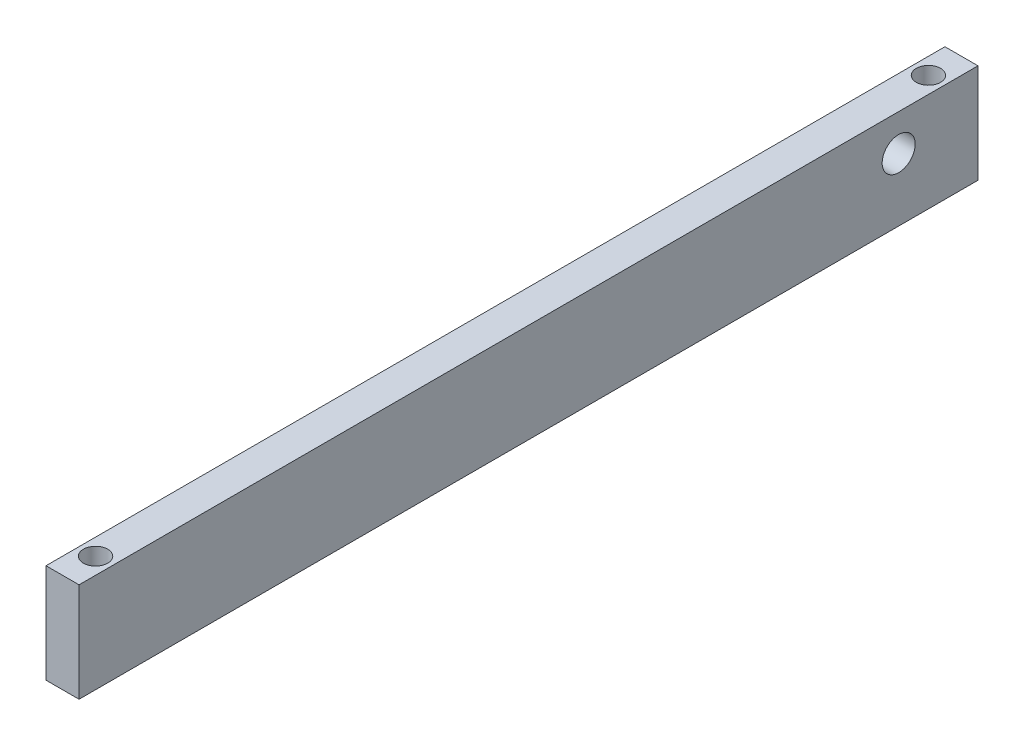
ISO-10303-21;
HEADER;
FILE_DESCRIPTION(('STEP AP214'),'2;1');
FILE_NAME('part.step','',(''),(''),'','','');
FILE_SCHEMA(('AUTOMOTIVE_DESIGN { 1 0 10303 214 1 1 1 1 }'));
ENDSEC;
DATA;
#1=APPLICATION_CONTEXT('core data for automotive mechanical design processes');
#2=APPLICATION_PROTOCOL_DEFINITION('international standard','automotive_design',2000,#1);
#3=PRODUCT_CONTEXT('',#1,'mechanical');
#4=PRODUCT('Part','Part','',(#3));
#5=PRODUCT_RELATED_PRODUCT_CATEGORY('part','',(#4));
#6=PRODUCT_DEFINITION_FORMATION('','',#4);
#7=PRODUCT_DEFINITION_CONTEXT('part definition',#1,'design');
#8=PRODUCT_DEFINITION('design','',#6,#7);
#9=PRODUCT_DEFINITION_SHAPE('','',#8);
#10=(LENGTH_UNIT() NAMED_UNIT(*) SI_UNIT(.MILLI.,.METRE.));
#11=(NAMED_UNIT(*) PLANE_ANGLE_UNIT() SI_UNIT($,.RADIAN.));
#12=(NAMED_UNIT(*) SI_UNIT($,.STERADIAN.) SOLID_ANGLE_UNIT());
#13=UNCERTAINTY_MEASURE_WITH_UNIT(LENGTH_MEASURE(1.E-05),#10,'distance_accuracy_value','');
#14=(GEOMETRIC_REPRESENTATION_CONTEXT(3) GLOBAL_UNCERTAINTY_ASSIGNED_CONTEXT((#13)) GLOBAL_UNIT_ASSIGNED_CONTEXT((#10,
#11,#12)) REPRESENTATION_CONTEXT('',''));
#15=CARTESIAN_POINT('',(0.,0.,0.));
#16=DIRECTION('',(0.,0.,1.));
#17=DIRECTION('',(1.,0.,0.));
#18=AXIS2_PLACEMENT_3D('',#15,#16,#17);
#19=CARTESIAN_POINT('',(0.,0.,172.72));
#20=DIRECTION('',(1.,0.,0.));
#21=DIRECTION('',(0.,1.,0.));
#22=AXIS2_PLACEMENT_3D('',#19,#20,#21);
#23=PLANE('',#22);
#24=CARTESIAN_POINT('',(0.,12.065,15.24));
#25=DIRECTION('',(1.,0.,0.));
#26=DIRECTION('',(0.,0.,-1.));
#27=AXIS2_PLACEMENT_3D('',#24,#25,#26);
#28=CIRCLE('',#27,3.17500010159999);
#29=CARTESIAN_POINT('',(0.,12.065,12.0649998984));
#30=VERTEX_POINT('',#29);
#31=EDGE_CURVE('E132',#30,#30,#28,.T.);
#32=ORIENTED_EDGE('',*,*,#31,.F.);
#33=EDGE_LOOP('',(#32));
#34=FACE_BOUND('',#33,.T.);
#35=DIRECTION('',(0.,-1.,0.));
#36=VECTOR('',#35,1.);
#37=CARTESIAN_POINT('',(0.,0.,0.));
#38=LINE('',#37,#36);
#39=CARTESIAN_POINT('',(0.,19.05,0.));
#40=VERTEX_POINT('',#39);
#41=CARTESIAN_POINT('',(0.,0.,0.));
#42=VERTEX_POINT('',#41);
#43=EDGE_CURVE('E114',#40,#42,#38,.T.);
#44=ORIENTED_EDGE('',*,*,#43,.F.);
#45=DIRECTION('',(0.,0.,-1.));
#46=VECTOR('',#45,1.);
#47=CARTESIAN_POINT('',(0.,19.05,172.72));
#48=LINE('',#47,#46);
#49=CARTESIAN_POINT('',(0.,19.05,172.72));
#50=VERTEX_POINT('',#49);
#51=EDGE_CURVE('E11',#50,#40,#48,.T.);
#52=ORIENTED_EDGE('',*,*,#51,.F.);
#53=DIRECTION('',(0.,-1.,0.));
#54=VECTOR('',#53,1.);
#55=CARTESIAN_POINT('',(0.,0.,172.72));
#56=LINE('',#55,#54);
#57=CARTESIAN_POINT('',(0.,0.,172.72));
#58=VERTEX_POINT('',#57);
#59=EDGE_CURVE('E103',#50,#58,#56,.T.);
#60=ORIENTED_EDGE('',*,*,#59,.T.);
#61=DIRECTION('',(0.,0.,-1.));
#62=VECTOR('',#61,1.);
#63=CARTESIAN_POINT('',(0.,0.,172.72));
#64=LINE('',#63,#62);
#65=EDGE_CURVE('E62',#58,#42,#64,.T.);
#66=ORIENTED_EDGE('',*,*,#65,.T.);
#67=EDGE_LOOP('',(#44,#52,#60,#66));
#68=FACE_BOUND('',#67,.T.);
#69=ADVANCED_FACE('F44',(#34,#68),#23,.T.);
#70=CARTESIAN_POINT('',(0.,19.05,172.72));
#71=DIRECTION('',(0.,1.,0.));
#72=DIRECTION('',(0.,0.,1.));
#73=AXIS2_PLACEMENT_3D('',#70,#71,#72);
#74=PLANE('',#73);
#75=CARTESIAN_POINT('',(-3.17499999999998,19.05,166.37));
#76=DIRECTION('',(0.,1.,0.));
#77=DIRECTION('',(0.,0.,1.));
#78=AXIS2_PLACEMENT_3D('',#75,#76,#77);
#79=CIRCLE('',#78,2.3368);
#80=CARTESIAN_POINT('',(-3.17499999999998,19.05,168.7068));
#81=VERTEX_POINT('',#80);
#82=EDGE_CURVE('E145',#81,#81,#79,.T.);
#83=ORIENTED_EDGE('',*,*,#82,.F.);
#84=EDGE_LOOP('',(#83));
#85=FACE_BOUND('',#84,.T.);
#86=CARTESIAN_POINT('',(-3.175,19.05,6.35));
#87=DIRECTION('',(0.,1.,0.));
#88=DIRECTION('',(0.,0.,1.));
#89=AXIS2_PLACEMENT_3D('',#86,#87,#88);
#90=CIRCLE('',#89,2.3368);
#91=CARTESIAN_POINT('',(-3.175,19.05,8.6868));
#92=VERTEX_POINT('',#91);
#93=EDGE_CURVE('E141',#92,#92,#90,.T.);
#94=ORIENTED_EDGE('',*,*,#93,.F.);
#95=EDGE_LOOP('',(#94));
#96=FACE_BOUND('',#95,.T.);
#97=DIRECTION('',(1.,0.,0.));
#98=VECTOR('',#97,1.);
#99=CARTESIAN_POINT('',(0.,19.05,0.));
#100=LINE('',#99,#98);
#101=CARTESIAN_POINT('',(-6.35,19.05,0.));
#102=VERTEX_POINT('',#101);
#103=EDGE_CURVE('E92',#102,#40,#100,.T.);
#104=ORIENTED_EDGE('',*,*,#103,.F.);
#105=DIRECTION('',(0.,0.,-1.));
#106=VECTOR('',#105,1.);
#107=CARTESIAN_POINT('',(-6.35,19.05,172.72));
#108=LINE('',#107,#106);
#109=CARTESIAN_POINT('',(-6.35,19.05,172.72));
#110=VERTEX_POINT('',#109);
#111=EDGE_CURVE('E54',#110,#102,#108,.T.);
#112=ORIENTED_EDGE('',*,*,#111,.F.);
#113=DIRECTION('',(1.,0.,0.));
#114=VECTOR('',#113,1.);
#115=CARTESIAN_POINT('',(0.,19.05,172.72));
#116=LINE('',#115,#114);
#117=EDGE_CURVE('E90',#110,#50,#116,.T.);
#118=ORIENTED_EDGE('',*,*,#117,.T.);
#119=ORIENTED_EDGE('',*,*,#51,.T.);
#120=EDGE_LOOP('',(#104,#112,#118,#119));
#121=FACE_BOUND('',#120,.T.);
#122=ADVANCED_FACE('F89',(#85,#96,#121),#74,.T.);
#123=CARTESIAN_POINT('',(-6.35,0.,172.72));
#124=DIRECTION('',(-1.,0.,0.));
#125=DIRECTION('',(0.,0.,1.));
#126=AXIS2_PLACEMENT_3D('',#123,#124,#125);
#127=PLANE('',#126);
#128=CARTESIAN_POINT('',(-6.35,12.065,15.24));
#129=DIRECTION('',(-1.,0.,0.));
#130=DIRECTION('',(0.,0.,1.));
#131=AXIS2_PLACEMENT_3D('',#128,#129,#130);
#132=CIRCLE('',#131,3.17500010159999);
#133=CARTESIAN_POINT('',(-6.35,12.065,18.4150001016));
#134=VERTEX_POINT('',#133);
#135=EDGE_CURVE('E47',#134,#134,#132,.T.);
#136=ORIENTED_EDGE('',*,*,#135,.F.);
#137=EDGE_LOOP('',(#136));
#138=FACE_BOUND('',#137,.T.);
#139=DIRECTION('',(0.,1.,0.));
#140=VECTOR('',#139,1.);
#141=CARTESIAN_POINT('',(-6.35,0.,0.));
#142=LINE('',#141,#140);
#143=CARTESIAN_POINT('',(-6.35,0.,0.));
#144=VERTEX_POINT('',#143);
#145=EDGE_CURVE('E119',#144,#102,#142,.T.);
#146=ORIENTED_EDGE('',*,*,#145,.F.);
#147=DIRECTION('',(0.,0.,-1.));
#148=VECTOR('',#147,1.);
#149=CARTESIAN_POINT('',(-6.35,0.,172.72));
#150=LINE('',#149,#148);
#151=CARTESIAN_POINT('',(-6.35,0.,172.72));
#152=VERTEX_POINT('',#151);
#153=EDGE_CURVE('E75',#152,#144,#150,.T.);
#154=ORIENTED_EDGE('',*,*,#153,.F.);
#155=DIRECTION('',(0.,1.,0.));
#156=VECTOR('',#155,1.);
#157=CARTESIAN_POINT('',(-6.35,0.,172.72));
#158=LINE('',#157,#156);
#159=EDGE_CURVE('E102',#152,#110,#158,.T.);
#160=ORIENTED_EDGE('',*,*,#159,.T.);
#161=ORIENTED_EDGE('',*,*,#111,.T.);
#162=EDGE_LOOP('',(#146,#154,#160,#161));
#163=FACE_BOUND('',#162,.T.);
#164=ADVANCED_FACE('F106',(#138,#163),#127,.T.);
#165=CARTESIAN_POINT('',(0.,0.,172.72));
#166=DIRECTION('',(0.,-1.,0.));
#167=DIRECTION('',(1.,0.,0.));
#168=AXIS2_PLACEMENT_3D('',#165,#166,#167);
#169=PLANE('',#168);
#170=CARTESIAN_POINT('',(-3.17499999999998,0.,166.37));
#171=DIRECTION('',(0.,1.,0.));
#172=DIRECTION('',(0.,0.,1.));
#173=AXIS2_PLACEMENT_3D('',#170,#171,#172);
#174=CIRCLE('',#173,2.3368);
#175=CARTESIAN_POINT('',(-3.17499999999998,0.,168.7068));
#176=VERTEX_POINT('',#175);
#177=EDGE_CURVE('E136',#176,#176,#174,.T.);
#178=ORIENTED_EDGE('',*,*,#177,.T.);
#179=EDGE_LOOP('',(#178));
#180=FACE_BOUND('',#179,.T.);
#181=CARTESIAN_POINT('',(-3.175,0.,6.35));
#182=DIRECTION('',(0.,1.,0.));
#183=DIRECTION('',(0.,0.,1.));
#184=AXIS2_PLACEMENT_3D('',#181,#182,#183);
#185=CIRCLE('',#184,2.3368);
#186=CARTESIAN_POINT('',(-3.175,0.,8.6868));
#187=VERTEX_POINT('',#186);
#188=EDGE_CURVE('E137',#187,#187,#185,.T.);
#189=ORIENTED_EDGE('',*,*,#188,.T.);
#190=EDGE_LOOP('',(#189));
#191=FACE_BOUND('',#190,.T.);
#192=DIRECTION('',(-1.,0.,0.));
#193=VECTOR('',#192,1.);
#194=CARTESIAN_POINT('',(0.,0.,0.));
#195=LINE('',#194,#193);
#196=EDGE_CURVE('E122',#42,#144,#195,.T.);
#197=ORIENTED_EDGE('',*,*,#196,.F.);
#198=ORIENTED_EDGE('',*,*,#65,.F.);
#199=DIRECTION('',(-1.,0.,0.));
#200=VECTOR('',#199,1.);
#201=CARTESIAN_POINT('',(0.,0.,172.72));
#202=LINE('',#201,#200);
#203=EDGE_CURVE('E108',#58,#152,#202,.T.);
#204=ORIENTED_EDGE('',*,*,#203,.T.);
#205=ORIENTED_EDGE('',*,*,#153,.T.);
#206=EDGE_LOOP('',(#197,#198,#204,#205));
#207=FACE_BOUND('',#206,.T.);
#208=ADVANCED_FACE('F153',(#180,#191,#207),#169,.T.);
#209=CARTESIAN_POINT('',(0.,0.,172.72));
#210=DIRECTION('',(0.,0.,1.));
#211=DIRECTION('',(1.,0.,0.));
#212=AXIS2_PLACEMENT_3D('',#209,#210,#211);
#213=PLANE('',#212);
#214=ORIENTED_EDGE('',*,*,#59,.F.);
#215=ORIENTED_EDGE('',*,*,#117,.F.);
#216=ORIENTED_EDGE('',*,*,#159,.F.);
#217=ORIENTED_EDGE('',*,*,#203,.F.);
#218=EDGE_LOOP('',(#214,#215,#216,#217));
#219=FACE_BOUND('',#218,.T.);
#220=ADVANCED_FACE('F100',(#219),#213,.T.);
#221=CARTESIAN_POINT('',(0.,0.,0.));
#222=DIRECTION('',(0.,0.,1.));
#223=DIRECTION('',(1.,0.,0.));
#224=AXIS2_PLACEMENT_3D('',#221,#222,#223);
#225=PLANE('',#224);
#226=ORIENTED_EDGE('',*,*,#43,.T.);
#227=ORIENTED_EDGE('',*,*,#196,.T.);
#228=ORIENTED_EDGE('',*,*,#145,.T.);
#229=ORIENTED_EDGE('',*,*,#103,.T.);
#230=EDGE_LOOP('',(#226,#227,#228,#229));
#231=FACE_BOUND('',#230,.T.);
#232=ADVANCED_FACE('F174',(#231),#225,.F.);
#233=CARTESIAN_POINT('',(-25.4,12.065,15.24));
#234=DIRECTION('',(1.,0.,0.));
#235=DIRECTION('',(0.,0.,-1.));
#236=AXIS2_PLACEMENT_3D('',#233,#234,#235);
#237=CYLINDRICAL_SURFACE('',#236,3.17500010159999);
#238=ORIENTED_EDGE('',*,*,#135,.T.);
#239=EDGE_LOOP('',(#238));
#240=FACE_BOUND('',#239,.T.);
#241=ORIENTED_EDGE('',*,*,#31,.T.);
#242=EDGE_LOOP('',(#241));
#243=FACE_BOUND('',#242,.T.);
#244=ADVANCED_FACE('F168',(#240,#243),#237,.F.);
#245=CARTESIAN_POINT('',(-3.175,0.,6.35));
#246=DIRECTION('',(0.,1.,0.));
#247=DIRECTION('',(0.,0.,1.));
#248=AXIS2_PLACEMENT_3D('',#245,#246,#247);
#249=CYLINDRICAL_SURFACE('',#248,2.3368);
#250=CARTESIAN_POINT('',(-3.175,0.,8.6868));
#251=CARTESIAN_POINT('',(-3.175,0.1984375,8.6868));
#252=CARTESIAN_POINT('',(-3.175,0.396875,8.6868));
#253=CARTESIAN_POINT('',(-3.175,0.79375,8.6868));
#254=CARTESIAN_POINT('',(-3.175,0.9921875,8.6868));
#255=CARTESIAN_POINT('',(-3.175,1.3890625,8.6868));
#256=CARTESIAN_POINT('',(-3.175,1.5875,8.6868));
#257=CARTESIAN_POINT('',(-3.175,1.984375,8.6868));
#258=CARTESIAN_POINT('',(-3.175,2.1828125,8.6868));
#259=CARTESIAN_POINT('',(-3.175,2.5796875,8.6868));
#260=CARTESIAN_POINT('',(-3.175,2.778125,8.6868));
#261=CARTESIAN_POINT('',(-3.175,3.175,8.6868));
#262=CARTESIAN_POINT('',(-3.175,3.3734375,8.6868));
#263=CARTESIAN_POINT('',(-3.175,3.7703125,8.6868));
#264=CARTESIAN_POINT('',(-3.175,3.96875,8.6868));
#265=CARTESIAN_POINT('',(-3.175,4.365625,8.6868));
#266=CARTESIAN_POINT('',(-3.175,4.5640625,8.6868));
#267=CARTESIAN_POINT('',(-3.175,4.9609375,8.6868));
#268=CARTESIAN_POINT('',(-3.175,5.159375,8.6868));
#269=CARTESIAN_POINT('',(-3.175,5.55625,8.6868));
#270=CARTESIAN_POINT('',(-3.175,5.7546875,8.6868));
#271=CARTESIAN_POINT('',(-3.175,6.1515625,8.6868));
#272=CARTESIAN_POINT('',(-3.175,6.35,8.6868));
#273=CARTESIAN_POINT('',(-3.175,6.746875,8.6868));
#274=CARTESIAN_POINT('',(-3.175,6.9453125,8.6868));
#275=CARTESIAN_POINT('',(-3.175,7.3421875,8.6868));
#276=CARTESIAN_POINT('',(-3.175,7.540625,8.6868));
#277=CARTESIAN_POINT('',(-3.175,7.9375,8.6868));
#278=CARTESIAN_POINT('',(-3.175,8.1359375,8.6868));
#279=CARTESIAN_POINT('',(-3.175,8.5328125,8.6868));
#280=CARTESIAN_POINT('',(-3.175,8.73125,8.6868));
#281=CARTESIAN_POINT('',(-3.175,9.128125,8.6868));
#282=CARTESIAN_POINT('',(-3.175,9.3265625,8.6868));
#283=CARTESIAN_POINT('',(-3.175,9.7234375,8.6868));
#284=CARTESIAN_POINT('',(-3.175,9.921875,8.6868));
#285=CARTESIAN_POINT('',(-3.175,10.31875,8.6868));
#286=CARTESIAN_POINT('',(-3.175,10.5171875,8.6868));
#287=CARTESIAN_POINT('',(-3.175,10.9140625,8.6868));
#288=CARTESIAN_POINT('',(-3.175,11.1125,8.6868));
#289=CARTESIAN_POINT('',(-3.175,11.509375,8.6868));
#290=CARTESIAN_POINT('',(-3.175,11.7078125,8.6868));
#291=CARTESIAN_POINT('',(-3.175,12.1046875,8.6868));
#292=CARTESIAN_POINT('',(-3.175,12.303125,8.6868));
#293=CARTESIAN_POINT('',(-3.175,12.7,8.6868));
#294=CARTESIAN_POINT('',(-3.175,12.8984375,8.6868));
#295=CARTESIAN_POINT('',(-3.175,13.2953125,8.6868));
#296=CARTESIAN_POINT('',(-3.175,13.49375,8.6868));
#297=CARTESIAN_POINT('',(-3.175,13.890625,8.6868));
#298=CARTESIAN_POINT('',(-3.175,14.0890625,8.6868));
#299=CARTESIAN_POINT('',(-3.175,14.4859375,8.6868));
#300=CARTESIAN_POINT('',(-3.175,14.684375,8.6868));
#301=CARTESIAN_POINT('',(-3.175,15.08125,8.6868));
#302=CARTESIAN_POINT('',(-3.175,15.2796875,8.6868));
#303=CARTESIAN_POINT('',(-3.175,15.6765625,8.6868));
#304=CARTESIAN_POINT('',(-3.175,15.875,8.6868));
#305=CARTESIAN_POINT('',(-3.175,16.271875,8.6868));
#306=CARTESIAN_POINT('',(-3.175,16.4703125,8.6868));
#307=CARTESIAN_POINT('',(-3.175,16.8671875,8.6868));
#308=CARTESIAN_POINT('',(-3.175,17.065625,8.6868));
#309=CARTESIAN_POINT('',(-3.175,17.4625,8.6868));
#310=CARTESIAN_POINT('',(-3.175,17.6609375,8.6868));
#311=CARTESIAN_POINT('',(-3.175,18.0578125,8.6868));
#312=CARTESIAN_POINT('',(-3.175,18.25625,8.6868));
#313=CARTESIAN_POINT('',(-3.175,18.653125,8.6868));
#314=CARTESIAN_POINT('',(-3.175,18.8515625,8.6868));
#315=CARTESIAN_POINT('',(-3.175,19.05,8.6868));
#316=B_SPLINE_CURVE_WITH_KNOTS('',3,(#250,#251,#252,#253,#254,#255,#256,#257,#258,#259,#260,
#261,#262,#263,#264,#265,#266,#267,#268,#269,#270,#271,#272,#273,#274,#275,#276,#277,#278,#279,
#280,#281,#282,#283,#284,#285,#286,#287,#288,#289,#290,#291,#292,#293,#294,#295,#296,#297,#298,
#299,#300,#301,#302,#303,#304,#305,#306,#307,#308,#309,#310,#311,#312,#313,#314,#315),
.UNSPECIFIED.,.F.,.F.,(4,2,2,2,2,2,2,2,2,2,2,2,2,2,2,2,2,2,2,2,2,2,2,2,2,2,2,2,2,2,2,2,4),(0.,
0.5953125,1.190625,1.7859375,2.38125,2.9765625,3.571875,4.1671875,4.7625,5.3578125,5.953125,
6.5484375,7.14375,7.7390625,8.334375,8.9296875,9.525,10.1203125,10.715625,11.3109375,11.90625,
12.5015625,13.096875,13.6921875,14.2875,14.8828125,15.478125,16.0734375,16.66875,17.2640625,
17.859375,18.4546875,19.05),.UNSPECIFIED.);
#317=EDGE_CURVE('BSEAM159',#187,#92,#316,.T.);
#318=ORIENTED_EDGE('',*,*,#188,.F.);
#319=ORIENTED_EDGE('',*,*,#93,.T.);
#320=ORIENTED_EDGE('',*,*,#317,.T.);
#321=ORIENTED_EDGE('',*,*,#317,.F.);
#322=EDGE_LOOP('',(#318,#320,#319,#321));
#323=FACE_BOUND('',#322,.T.);
#324=ADVANCED_FACE('F159',(#323),#249,.F.);
#325=CARTESIAN_POINT('',(-3.17499999999998,0.,166.37));
#326=DIRECTION('',(0.,1.,0.));
#327=DIRECTION('',(0.,0.,1.));
#328=AXIS2_PLACEMENT_3D('',#325,#326,#327);
#329=CYLINDRICAL_SURFACE('',#328,2.3368);
#330=CARTESIAN_POINT('',(-3.17499999999998,0.,168.7068));
#331=CARTESIAN_POINT('',(-3.17499999999998,0.1984375,168.7068));
#332=CARTESIAN_POINT('',(-3.17499999999998,0.396875,168.7068));
#333=CARTESIAN_POINT('',(-3.17499999999998,0.79375,168.7068));
#334=CARTESIAN_POINT('',(-3.17499999999998,0.9921875,168.7068));
#335=CARTESIAN_POINT('',(-3.17499999999998,1.3890625,168.7068));
#336=CARTESIAN_POINT('',(-3.17499999999998,1.5875,168.7068));
#337=CARTESIAN_POINT('',(-3.17499999999998,1.984375,168.7068));
#338=CARTESIAN_POINT('',(-3.17499999999998,2.1828125,168.7068));
#339=CARTESIAN_POINT('',(-3.17499999999998,2.5796875,168.7068));
#340=CARTESIAN_POINT('',(-3.17499999999998,2.778125,168.7068));
#341=CARTESIAN_POINT('',(-3.17499999999998,3.175,168.7068));
#342=CARTESIAN_POINT('',(-3.17499999999998,3.3734375,168.7068));
#343=CARTESIAN_POINT('',(-3.17499999999998,3.7703125,168.7068));
#344=CARTESIAN_POINT('',(-3.17499999999998,3.96875,168.7068));
#345=CARTESIAN_POINT('',(-3.17499999999998,4.365625,168.7068));
#346=CARTESIAN_POINT('',(-3.17499999999998,4.5640625,168.7068));
#347=CARTESIAN_POINT('',(-3.17499999999998,4.9609375,168.7068));
#348=CARTESIAN_POINT('',(-3.17499999999998,5.159375,168.7068));
#349=CARTESIAN_POINT('',(-3.17499999999998,5.55625,168.7068));
#350=CARTESIAN_POINT('',(-3.17499999999998,5.7546875,168.7068));
#351=CARTESIAN_POINT('',(-3.17499999999998,6.1515625,168.7068));
#352=CARTESIAN_POINT('',(-3.17499999999998,6.35,168.7068));
#353=CARTESIAN_POINT('',(-3.17499999999998,6.746875,168.7068));
#354=CARTESIAN_POINT('',(-3.17499999999998,6.9453125,168.7068));
#355=CARTESIAN_POINT('',(-3.17499999999998,7.3421875,168.7068));
#356=CARTESIAN_POINT('',(-3.17499999999998,7.540625,168.7068));
#357=CARTESIAN_POINT('',(-3.17499999999998,7.9375,168.7068));
#358=CARTESIAN_POINT('',(-3.17499999999998,8.1359375,168.7068));
#359=CARTESIAN_POINT('',(-3.17499999999998,8.5328125,168.7068));
#360=CARTESIAN_POINT('',(-3.17499999999998,8.73125,168.7068));
#361=CARTESIAN_POINT('',(-3.17499999999998,9.128125,168.7068));
#362=CARTESIAN_POINT('',(-3.17499999999998,9.3265625,168.7068));
#363=CARTESIAN_POINT('',(-3.17499999999998,9.7234375,168.7068));
#364=CARTESIAN_POINT('',(-3.17499999999998,9.921875,168.7068));
#365=CARTESIAN_POINT('',(-3.17499999999998,10.31875,168.7068));
#366=CARTESIAN_POINT('',(-3.17499999999998,10.5171875,168.7068));
#367=CARTESIAN_POINT('',(-3.17499999999998,10.9140625,168.7068));
#368=CARTESIAN_POINT('',(-3.17499999999998,11.1125,168.7068));
#369=CARTESIAN_POINT('',(-3.17499999999998,11.509375,168.7068));
#370=CARTESIAN_POINT('',(-3.17499999999998,11.7078125,168.7068));
#371=CARTESIAN_POINT('',(-3.17499999999998,12.1046875,168.7068));
#372=CARTESIAN_POINT('',(-3.17499999999998,12.303125,168.7068));
#373=CARTESIAN_POINT('',(-3.17499999999998,12.7,168.7068));
#374=CARTESIAN_POINT('',(-3.17499999999998,12.8984375,168.7068));
#375=CARTESIAN_POINT('',(-3.17499999999998,13.2953125,168.7068));
#376=CARTESIAN_POINT('',(-3.17499999999998,13.49375,168.7068));
#377=CARTESIAN_POINT('',(-3.17499999999998,13.890625,168.7068));
#378=CARTESIAN_POINT('',(-3.17499999999998,14.0890625,168.7068));
#379=CARTESIAN_POINT('',(-3.17499999999998,14.4859375,168.7068));
#380=CARTESIAN_POINT('',(-3.17499999999998,14.684375,168.7068));
#381=CARTESIAN_POINT('',(-3.17499999999998,15.08125,168.7068));
#382=CARTESIAN_POINT('',(-3.17499999999998,15.2796875,168.7068));
#383=CARTESIAN_POINT('',(-3.17499999999998,15.6765625,168.7068));
#384=CARTESIAN_POINT('',(-3.17499999999998,15.875,168.7068));
#385=CARTESIAN_POINT('',(-3.17499999999998,16.271875,168.7068));
#386=CARTESIAN_POINT('',(-3.17499999999998,16.4703125,168.7068));
#387=CARTESIAN_POINT('',(-3.17499999999998,16.8671875,168.7068));
#388=CARTESIAN_POINT('',(-3.17499999999998,17.065625,168.7068));
#389=CARTESIAN_POINT('',(-3.17499999999998,17.4625,168.7068));
#390=CARTESIAN_POINT('',(-3.17499999999998,17.6609375,168.7068));
#391=CARTESIAN_POINT('',(-3.17499999999998,18.0578125,168.7068));
#392=CARTESIAN_POINT('',(-3.17499999999998,18.25625,168.7068));
#393=CARTESIAN_POINT('',(-3.17499999999998,18.653125,168.7068));
#394=CARTESIAN_POINT('',(-3.17499999999998,18.8515625,168.7068));
#395=CARTESIAN_POINT('',(-3.17499999999998,19.05,168.7068));
#396=B_SPLINE_CURVE_WITH_KNOTS('',3,(#330,#331,#332,#333,#334,#335,#336,#337,#338,#339,#340,
#341,#342,#343,#344,#345,#346,#347,#348,#349,#350,#351,#352,#353,#354,#355,#356,#357,#358,#359,
#360,#361,#362,#363,#364,#365,#366,#367,#368,#369,#370,#371,#372,#373,#374,#375,#376,#377,#378,
#379,#380,#381,#382,#383,#384,#385,#386,#387,#388,#389,#390,#391,#392,#393,#394,#395),
.UNSPECIFIED.,.F.,.F.,(4,2,2,2,2,2,2,2,2,2,2,2,2,2,2,2,2,2,2,2,2,2,2,2,2,2,2,2,2,2,2,2,4),(0.,
0.5953125,1.190625,1.7859375,2.38125,2.9765625,3.571875,4.1671875,4.7625,5.3578125,5.953125,
6.5484375,7.14375,7.7390625,8.334375,8.9296875,9.525,10.1203125,10.715625,11.3109375,11.90625,
12.5015625,13.096875,13.6921875,14.2875,14.8828125,15.478125,16.0734375,16.66875,17.2640625,
17.859375,18.4546875,19.05),.UNSPECIFIED.);
#397=EDGE_CURVE('BSEAM156',#176,#81,#396,.T.);
#398=ORIENTED_EDGE('',*,*,#177,.F.);
#399=ORIENTED_EDGE('',*,*,#82,.T.);
#400=ORIENTED_EDGE('',*,*,#397,.T.);
#401=ORIENTED_EDGE('',*,*,#397,.F.);
#402=EDGE_LOOP('',(#398,#400,#399,#401));
#403=FACE_BOUND('',#402,.T.);
#404=ADVANCED_FACE('F156',(#403),#329,.F.);
#405=CLOSED_SHELL('',(#69,#122,#164,#208,#220,#232,#244,#324,#404));
#406=MANIFOLD_SOLID_BREP('B2',#405);
#407=ADVANCED_BREP_SHAPE_REPRESENTATION('',(#18,#406),#14);
#408=SHAPE_DEFINITION_REPRESENTATION(#9,#407);
ENDSEC;
END-ISO-10303-21;
